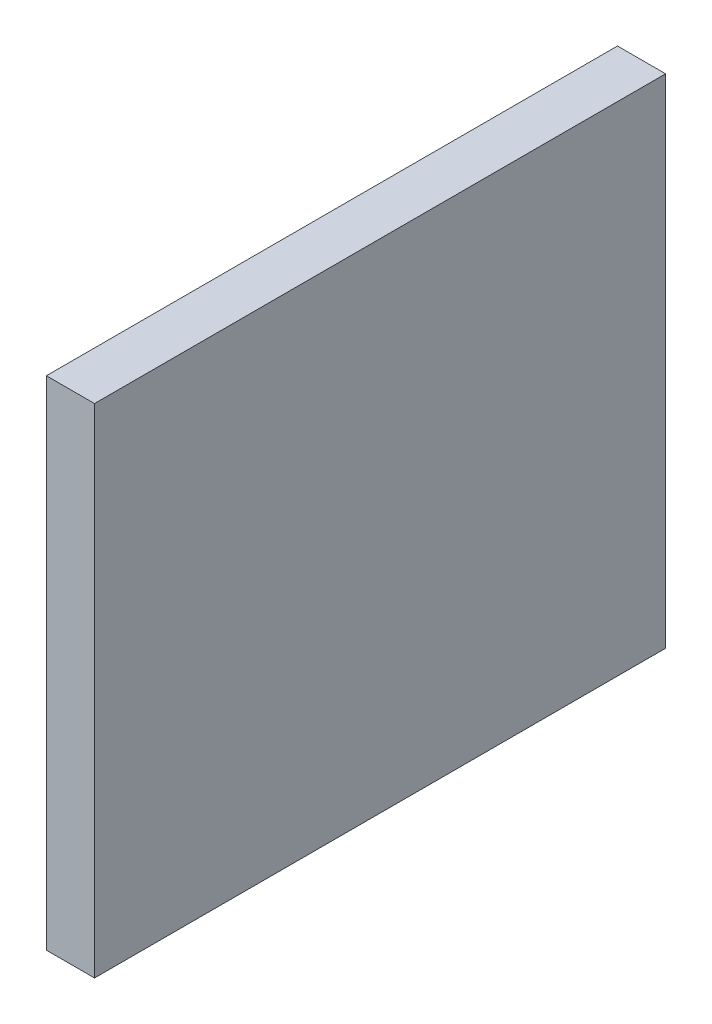
ISO-10303-21;
HEADER;
FILE_DESCRIPTION(('STEP AP214'),'2;1');
FILE_NAME('part.step','',(''),(''),'','','');
FILE_SCHEMA(('AUTOMOTIVE_DESIGN { 1 0 10303 214 1 1 1 1 }'));
ENDSEC;
DATA;
#1=APPLICATION_CONTEXT('core data for automotive mechanical design processes');
#2=APPLICATION_PROTOCOL_DEFINITION('international standard','automotive_design',2000,#1);
#3=PRODUCT_CONTEXT('',#1,'mechanical');
#4=PRODUCT('Part','Part','',(#3));
#5=PRODUCT_RELATED_PRODUCT_CATEGORY('part','',(#4));
#6=PRODUCT_DEFINITION_FORMATION('','',#4);
#7=PRODUCT_DEFINITION_CONTEXT('part definition',#1,'design');
#8=PRODUCT_DEFINITION('design','',#6,#7);
#9=PRODUCT_DEFINITION_SHAPE('','',#8);
#10=(LENGTH_UNIT() NAMED_UNIT(*) SI_UNIT(.MILLI.,.METRE.));
#11=(NAMED_UNIT(*) PLANE_ANGLE_UNIT() SI_UNIT($,.RADIAN.));
#12=(NAMED_UNIT(*) SI_UNIT($,.STERADIAN.) SOLID_ANGLE_UNIT());
#13=UNCERTAINTY_MEASURE_WITH_UNIT(LENGTH_MEASURE(1.E-05),#10,'distance_accuracy_value','');
#14=(GEOMETRIC_REPRESENTATION_CONTEXT(3) GLOBAL_UNCERTAINTY_ASSIGNED_CONTEXT((#13)) GLOBAL_UNIT_ASSIGNED_CONTEXT((#10,
#11,#12)) REPRESENTATION_CONTEXT('',''));
#15=CARTESIAN_POINT('',(0.,0.,0.));
#16=DIRECTION('',(0.,0.,1.));
#17=DIRECTION('',(1.,0.,0.));
#18=AXIS2_PLACEMENT_3D('',#15,#16,#17);
#19=CARTESIAN_POINT('',(0.,0.,0.));
#20=DIRECTION('',(0.,0.,1.));
#21=DIRECTION('',(1.,0.,0.));
#22=AXIS2_PLACEMENT_3D('',#19,#20,#21);
#23=PLANE('',#22);
#24=DIRECTION('',(1.,0.,0.));
#25=VECTOR('',#24,1.);
#26=CARTESIAN_POINT('',(-210.,-250.,0.));
#27=LINE('',#26,#25);
#28=CARTESIAN_POINT('',(-210.,-250.,0.));
#29=VERTEX_POINT('',#28);
#30=CARTESIAN_POINT('',(-190.95,-250.,0.));
#31=VERTEX_POINT('',#30);
#32=EDGE_CURVE('E85',#29,#31,#27,.T.);
#33=ORIENTED_EDGE('',*,*,#32,.F.);
#34=DIRECTION('',(0.,-1.,0.));
#35=VECTOR('',#34,1.);
#36=CARTESIAN_POINT('',(-210.,-53.1314680617709,0.));
#37=LINE('',#36,#35);
#38=CARTESIAN_POINT('',(-210.,-53.1314680617709,0.));
#39=VERTEX_POINT('',#38);
#40=EDGE_CURVE('E96',#39,#29,#37,.T.);
#41=ORIENTED_EDGE('',*,*,#40,.F.);
#42=DIRECTION('',(-1.,0.,0.));
#43=VECTOR('',#42,1.);
#44=CARTESIAN_POINT('',(-190.95,-53.1314680617709,0.));
#45=LINE('',#44,#43);
#46=CARTESIAN_POINT('',(-190.95,-53.1314680617709,0.));
#47=VERTEX_POINT('',#46);
#48=EDGE_CURVE('E87',#47,#39,#45,.T.);
#49=ORIENTED_EDGE('',*,*,#48,.F.);
#50=DIRECTION('',(0.,1.,0.));
#51=VECTOR('',#50,1.);
#52=CARTESIAN_POINT('',(-190.95,-250.,0.));
#53=LINE('',#52,#51);
#54=EDGE_CURVE('E77',#31,#47,#53,.T.);
#55=ORIENTED_EDGE('',*,*,#54,.F.);
#56=EDGE_LOOP('',(#33,#41,#49,#55));
#57=FACE_BOUND('',#56,.T.);
#58=ADVANCED_FACE('F35',(#57),#23,.F.);
#59=CARTESIAN_POINT('',(-210.,-53.1314680617709,423.78807185347));
#60=DIRECTION('',(1.,0.,0.));
#61=DIRECTION('',(0.,1.,0.));
#62=AXIS2_PLACEMENT_3D('',#59,#60,#61);
#63=PLANE('',#62);
#64=DIRECTION('',(0.,0.,-1.));
#65=VECTOR('',#64,1.);
#66=CARTESIAN_POINT('',(-210.,-250.,423.78807185347));
#67=LINE('',#66,#65);
#68=CARTESIAN_POINT('',(-210.,-250.,226.));
#69=VERTEX_POINT('',#68);
#70=EDGE_CURVE('E90',#69,#29,#67,.T.);
#71=ORIENTED_EDGE('',*,*,#70,.F.);
#72=DIRECTION('',(0.,1.,0.));
#73=VECTOR('',#72,1.);
#74=CARTESIAN_POINT('',(-210.,-53.1314680617709,226.));
#75=LINE('',#74,#73);
#76=CARTESIAN_POINT('',(-210.,-53.1314680617709,226.));
#77=VERTEX_POINT('',#76);
#78=EDGE_CURVE('E39',#69,#77,#75,.T.);
#79=ORIENTED_EDGE('',*,*,#78,.T.);
#80=DIRECTION('',(0.,0.,-1.));
#81=VECTOR('',#80,1.);
#82=CARTESIAN_POINT('',(-210.,-53.1314680617709,423.78807185347));
#83=LINE('',#82,#81);
#84=EDGE_CURVE('E99',#77,#39,#83,.T.);
#85=ORIENTED_EDGE('',*,*,#84,.T.);
#86=ORIENTED_EDGE('',*,*,#40,.T.);
#87=EDGE_LOOP('',(#71,#79,#85,#86));
#88=FACE_BOUND('',#87,.T.);
#89=ADVANCED_FACE('F108',(#88),#63,.F.);
#90=CARTESIAN_POINT('',(-190.95,-53.1314680617709,423.78807185347));
#91=DIRECTION('',(0.,-1.,0.));
#92=DIRECTION('',(0.,0.,-1.));
#93=AXIS2_PLACEMENT_3D('',#90,#91,#92);
#94=PLANE('',#93);
#95=ORIENTED_EDGE('',*,*,#84,.F.);
#96=DIRECTION('',(1.,0.,0.));
#97=VECTOR('',#96,1.);
#98=CARTESIAN_POINT('',(-190.95,-53.1314680617709,226.));
#99=LINE('',#98,#97);
#100=CARTESIAN_POINT('',(-190.95,-53.1314680617709,226.));
#101=VERTEX_POINT('',#100);
#102=EDGE_CURVE('E105',#77,#101,#99,.T.);
#103=ORIENTED_EDGE('',*,*,#102,.T.);
#104=DIRECTION('',(0.,0.,-1.));
#105=VECTOR('',#104,1.);
#106=CARTESIAN_POINT('',(-190.95,-53.1314680617709,423.78807185347));
#107=LINE('',#106,#105);
#108=EDGE_CURVE('E81',#101,#47,#107,.T.);
#109=ORIENTED_EDGE('',*,*,#108,.T.);
#110=ORIENTED_EDGE('',*,*,#48,.T.);
#111=EDGE_LOOP('',(#95,#103,#109,#110));
#112=FACE_BOUND('',#111,.T.);
#113=ADVANCED_FACE('F104',(#112),#94,.F.);
#114=CARTESIAN_POINT('',(-190.95,-250.,423.78807185347));
#115=DIRECTION('',(-1.,0.,0.));
#116=DIRECTION('',(0.,0.,1.));
#117=AXIS2_PLACEMENT_3D('',#114,#115,#116);
#118=PLANE('',#117);
#119=ORIENTED_EDGE('',*,*,#108,.F.);
#120=DIRECTION('',(0.,-1.,0.));
#121=VECTOR('',#120,1.);
#122=CARTESIAN_POINT('',(-190.95,-250.,226.));
#123=LINE('',#122,#121);
#124=CARTESIAN_POINT('',(-190.95,-250.,226.));
#125=VERTEX_POINT('',#124);
#126=EDGE_CURVE('E44',#101,#125,#123,.T.);
#127=ORIENTED_EDGE('',*,*,#126,.T.);
#128=DIRECTION('',(0.,0.,-1.));
#129=VECTOR('',#128,1.);
#130=CARTESIAN_POINT('',(-190.95,-250.,423.78807185347));
#131=LINE('',#130,#129);
#132=EDGE_CURVE('E74',#125,#31,#131,.T.);
#133=ORIENTED_EDGE('',*,*,#132,.T.);
#134=ORIENTED_EDGE('',*,*,#54,.T.);
#135=EDGE_LOOP('',(#119,#127,#133,#134));
#136=FACE_BOUND('',#135,.T.);
#137=ADVANCED_FACE('F76',(#136),#118,.F.);
#138=CARTESIAN_POINT('',(-210.,-250.,423.78807185347));
#139=DIRECTION('',(0.,1.,0.));
#140=DIRECTION('',(0.,0.,1.));
#141=AXIS2_PLACEMENT_3D('',#138,#139,#140);
#142=PLANE('',#141);
#143=ORIENTED_EDGE('',*,*,#132,.F.);
#144=DIRECTION('',(-1.,0.,0.));
#145=VECTOR('',#144,1.);
#146=CARTESIAN_POINT('',(-210.,-250.,226.));
#147=LINE('',#146,#145);
#148=EDGE_CURVE('E11',#125,#69,#147,.T.);
#149=ORIENTED_EDGE('',*,*,#148,.T.);
#150=ORIENTED_EDGE('',*,*,#70,.T.);
#151=ORIENTED_EDGE('',*,*,#32,.T.);
#152=EDGE_LOOP('',(#143,#149,#150,#151));
#153=FACE_BOUND('',#152,.T.);
#154=ADVANCED_FACE('F37',(#153),#142,.F.);
#155=CARTESIAN_POINT('',(0.,0.,226.));
#156=DIRECTION('',(0.,0.,-1.));
#157=DIRECTION('',(-1.,0.,0.));
#158=AXIS2_PLACEMENT_3D('',#155,#156,#157);
#159=PLANE('',#158);
#160=ORIENTED_EDGE('',*,*,#126,.F.);
#161=ORIENTED_EDGE('',*,*,#102,.F.);
#162=ORIENTED_EDGE('',*,*,#78,.F.);
#163=ORIENTED_EDGE('',*,*,#148,.F.);
#164=EDGE_LOOP('',(#160,#161,#162,#163));
#165=FACE_BOUND('',#164,.T.);
#166=ADVANCED_FACE('F122',(#165),#159,.F.);
#167=CLOSED_SHELL('',(#58,#89,#113,#137,#154,#166));
#168=MANIFOLD_SOLID_BREP('B2',#167);
#169=ADVANCED_BREP_SHAPE_REPRESENTATION('',(#18,#168),#14);
#170=SHAPE_DEFINITION_REPRESENTATION(#9,#169);
ENDSEC;
END-ISO-10303-21;
